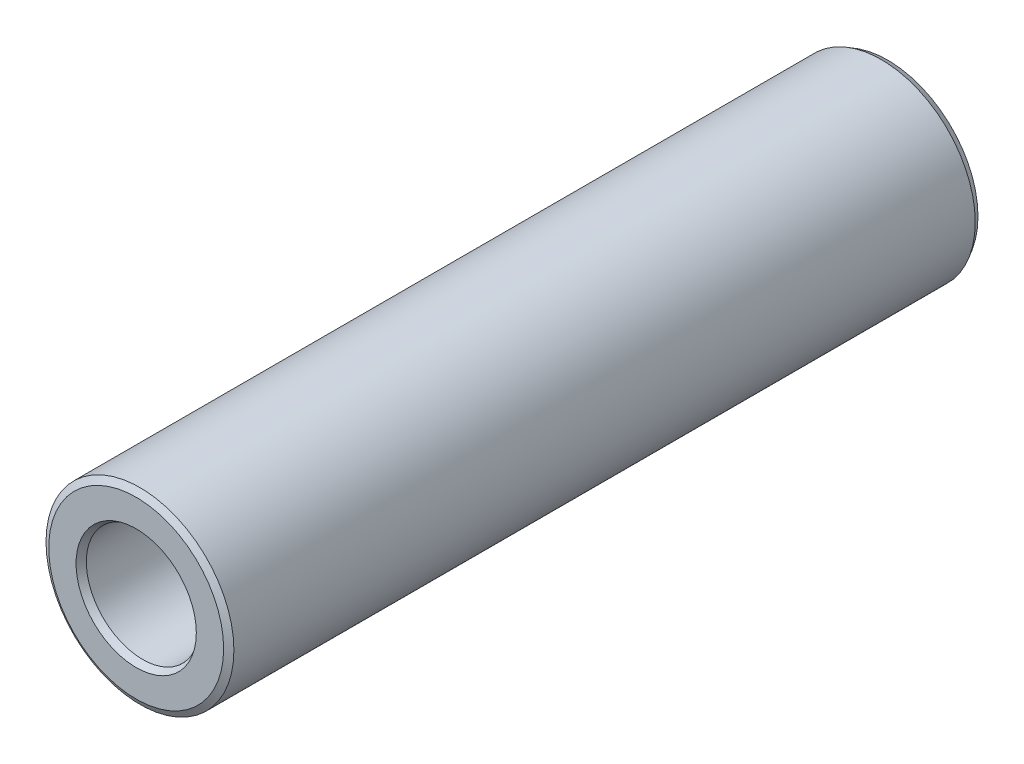
ISO-10303-21;
HEADER;
FILE_DESCRIPTION(('STEP AP214'),'2;1');
FILE_NAME('part.step','',(''),(''),'','','');
FILE_SCHEMA(('AUTOMOTIVE_DESIGN { 1 0 10303 214 1 1 1 1 }'));
ENDSEC;
DATA;
#1=APPLICATION_CONTEXT('core data for automotive mechanical design processes');
#2=APPLICATION_PROTOCOL_DEFINITION('international standard','automotive_design',2000,#1);
#3=PRODUCT_CONTEXT('',#1,'mechanical');
#4=PRODUCT('Part','Part','',(#3));
#5=PRODUCT_RELATED_PRODUCT_CATEGORY('part','',(#4));
#6=PRODUCT_DEFINITION_FORMATION('','',#4);
#7=PRODUCT_DEFINITION_CONTEXT('part definition',#1,'design');
#8=PRODUCT_DEFINITION('design','',#6,#7);
#9=PRODUCT_DEFINITION_SHAPE('','',#8);
#10=(LENGTH_UNIT() NAMED_UNIT(*) SI_UNIT(.MILLI.,.METRE.));
#11=(NAMED_UNIT(*) PLANE_ANGLE_UNIT() SI_UNIT($,.RADIAN.));
#12=(NAMED_UNIT(*) SI_UNIT($,.STERADIAN.) SOLID_ANGLE_UNIT());
#13=UNCERTAINTY_MEASURE_WITH_UNIT(LENGTH_MEASURE(1.E-05),#10,'distance_accuracy_value','');
#14=(GEOMETRIC_REPRESENTATION_CONTEXT(3) GLOBAL_UNCERTAINTY_ASSIGNED_CONTEXT((#13)) GLOBAL_UNIT_ASSIGNED_CONTEXT((#10,
#11,#12)) REPRESENTATION_CONTEXT('',''));
#15=CARTESIAN_POINT('',(0.,0.,0.));
#16=DIRECTION('',(0.,0.,1.));
#17=DIRECTION('',(1.,0.,0.));
#18=AXIS2_PLACEMENT_3D('',#15,#16,#17);
#19=CARTESIAN_POINT('',(0.,0.,10.));
#20=DIRECTION('',(0.,0.,1.));
#21=DIRECTION('',(1.,0.,0.));
#22=AXIS2_PLACEMENT_3D('',#19,#20,#21);
#23=PLANE('',#22);
#24=CARTESIAN_POINT('',(0.,0.,10.));
#25=DIRECTION('',(0.,0.,1.));
#26=DIRECTION('',(1.,0.,0.));
#27=AXIS2_PLACEMENT_3D('',#24,#25,#26);
#28=CIRCLE('',#27,1.6);
#29=CARTESIAN_POINT('',(1.6,0.,10.));
#30=VERTEX_POINT('',#29);
#31=EDGE_CURVE('E10',#30,#30,#28,.F.);
#32=ORIENTED_EDGE('',*,*,#31,.T.);
#33=EDGE_LOOP('',(#32));
#34=FACE_BOUND('',#33,.T.);
#35=CARTESIAN_POINT('',(0.,0.,10.));
#36=DIRECTION('',(0.,0.,1.));
#37=DIRECTION('',(1.,0.,0.));
#38=AXIS2_PLACEMENT_3D('',#35,#36,#37);
#39=CIRCLE('',#38,2.32679491924311);
#40=CARTESIAN_POINT('',(2.32679491924311,0.,10.));
#41=VERTEX_POINT('',#40);
#42=EDGE_CURVE('E51',#41,#41,#39,.T.);
#43=ORIENTED_EDGE('',*,*,#42,.T.);
#44=EDGE_LOOP('',(#43));
#45=FACE_BOUND('',#44,.T.);
#46=ADVANCED_FACE('F43',(#34,#45),#23,.T.);
#47=CARTESIAN_POINT('',(0.,0.,-10.));
#48=DIRECTION('',(0.,0.,1.));
#49=DIRECTION('',(1.,0.,0.));
#50=AXIS2_PLACEMENT_3D('',#47,#48,#49);
#51=PLANE('',#50);
#52=CARTESIAN_POINT('',(0.,0.,-10.));
#53=DIRECTION('',(0.,0.,1.));
#54=DIRECTION('',(1.,0.,0.));
#55=AXIS2_PLACEMENT_3D('',#52,#53,#54);
#56=CIRCLE('',#55,1.67320508075689);
#57=CARTESIAN_POINT('',(1.67320508075689,0.,-10.));
#58=VERTEX_POINT('',#57);
#59=EDGE_CURVE('E68',#58,#58,#56,.T.);
#60=ORIENTED_EDGE('',*,*,#59,.T.);
#61=EDGE_LOOP('',(#60));
#62=FACE_BOUND('',#61,.T.);
#63=CARTESIAN_POINT('',(0.,0.,-10.));
#64=DIRECTION('',(0.,0.,1.));
#65=DIRECTION('',(1.,0.,0.));
#66=AXIS2_PLACEMENT_3D('',#63,#64,#65);
#67=CIRCLE('',#66,2.39999999999999);
#68=CARTESIAN_POINT('',(2.39999999999999,0.,-10.));
#69=VERTEX_POINT('',#68);
#70=EDGE_CURVE('E71',#69,#69,#67,.F.);
#71=ORIENTED_EDGE('',*,*,#70,.T.);
#72=EDGE_LOOP('',(#71));
#73=FACE_BOUND('',#72,.T.);
#74=ADVANCED_FACE('F80',(#62,#73),#51,.F.);
#75=CARTESIAN_POINT('',(0.,0.,10.));
#76=DIRECTION('',(0.,0.,-1.));
#77=DIRECTION('',(-1.,0.,0.));
#78=AXIS2_PLACEMENT_3D('',#75,#76,#77);
#79=CYLINDRICAL_SURFACE('',#78,2.5);
#80=CARTESIAN_POINT('',(0.,0.,-9.82679491924309));
#81=DIRECTION('',(0.,0.,1.));
#82=DIRECTION('',(1.,0.,0.));
#83=AXIS2_PLACEMENT_3D('',#80,#81,#82);
#84=CIRCLE('',#83,2.5);
#85=CARTESIAN_POINT('',(2.5,0.,-9.82679491924309));
#86=VERTEX_POINT('',#85);
#87=EDGE_CURVE('E54',#86,#86,#84,.T.);
#88=ORIENTED_EDGE('',*,*,#87,.T.);
#89=EDGE_LOOP('',(#88));
#90=FACE_BOUND('',#89,.T.);
#91=CARTESIAN_POINT('',(0.,0.,9.9));
#92=DIRECTION('',(0.,0.,1.));
#93=DIRECTION('',(1.,0.,0.));
#94=AXIS2_PLACEMENT_3D('',#91,#92,#93);
#95=CIRCLE('',#94,2.5);
#96=CARTESIAN_POINT('',(2.5,0.,9.9));
#97=VERTEX_POINT('',#96);
#98=EDGE_CURVE('E56',#97,#97,#95,.F.);
#99=ORIENTED_EDGE('',*,*,#98,.T.);
#100=EDGE_LOOP('',(#99));
#101=FACE_BOUND('',#100,.T.);
#102=ADVANCED_FACE('F87',(#90,#101),#79,.T.);
#103=CARTESIAN_POINT('',(0.,0.,10.));
#104=DIRECTION('',(0.,0.,-1.));
#105=DIRECTION('',(-1.,0.,0.));
#106=AXIS2_PLACEMENT_3D('',#103,#104,#105);
#107=CYLINDRICAL_SURFACE('',#106,1.5);
#108=CARTESIAN_POINT('',(0.,0.,-9.9));
#109=DIRECTION('',(0.,0.,1.));
#110=DIRECTION('',(1.,0.,0.));
#111=AXIS2_PLACEMENT_3D('',#108,#109,#110);
#112=CIRCLE('',#111,1.5);
#113=CARTESIAN_POINT('',(1.5,0.,-9.9));
#114=VERTEX_POINT('',#113);
#115=EDGE_CURVE('E61',#114,#114,#112,.F.);
#116=ORIENTED_EDGE('',*,*,#115,.T.);
#117=EDGE_LOOP('',(#116));
#118=FACE_BOUND('',#117,.T.);
#119=CARTESIAN_POINT('',(0.,0.,9.82679491924311));
#120=DIRECTION('',(0.,0.,1.));
#121=DIRECTION('',(1.,0.,0.));
#122=AXIS2_PLACEMENT_3D('',#119,#120,#121);
#123=CIRCLE('',#122,1.5);
#124=CARTESIAN_POINT('',(1.5,0.,9.82679491924311));
#125=VERTEX_POINT('',#124);
#126=EDGE_CURVE('E70',#125,#125,#123,.T.);
#127=ORIENTED_EDGE('',*,*,#126,.T.);
#128=EDGE_LOOP('',(#127));
#129=FACE_BOUND('',#128,.T.);
#130=ADVANCED_FACE('F89',(#118,#129),#107,.F.);
#131=CARTESIAN_POINT('',(0.,0.,-10.));
#132=DIRECTION('',(0.,0.,-1.));
#133=DIRECTION('',(-1.,0.,0.));
#134=AXIS2_PLACEMENT_3D('',#131,#132,#133);
#135=CONICAL_SURFACE('',#134,1.67320508075689,1.0471975511966);
#136=ORIENTED_EDGE('',*,*,#115,.F.);
#137=EDGE_LOOP('',(#136));
#138=FACE_BOUND('',#137,.T.);
#139=ORIENTED_EDGE('',*,*,#59,.F.);
#140=EDGE_LOOP('',(#139));
#141=FACE_BOUND('',#140,.T.);
#142=ADVANCED_FACE('F84',(#138,#141),#135,.F.);
#143=CARTESIAN_POINT('',(0.,0.,-9.82679491924309));
#144=DIRECTION('',(0.,0.,1.));
#145=DIRECTION('',(1.,0.,0.));
#146=AXIS2_PLACEMENT_3D('',#143,#144,#145);
#147=CONICAL_SURFACE('',#146,2.5,0.523598775598298);
#148=ORIENTED_EDGE('',*,*,#70,.F.);
#149=EDGE_LOOP('',(#148));
#150=FACE_BOUND('',#149,.T.);
#151=ORIENTED_EDGE('',*,*,#87,.F.);
#152=EDGE_LOOP('',(#151));
#153=FACE_BOUND('',#152,.T.);
#154=ADVANCED_FACE('F76',(#150,#153),#147,.T.);
#155=CARTESIAN_POINT('',(0.,0.,9.82679491924311));
#156=DIRECTION('',(0.,0.,1.));
#157=DIRECTION('',(1.,0.,0.));
#158=AXIS2_PLACEMENT_3D('',#155,#156,#157);
#159=CONICAL_SURFACE('',#158,1.5,0.5235987755983);
#160=ORIENTED_EDGE('',*,*,#31,.F.);
#161=EDGE_LOOP('',(#160));
#162=FACE_BOUND('',#161,.T.);
#163=ORIENTED_EDGE('',*,*,#126,.F.);
#164=EDGE_LOOP('',(#163));
#165=FACE_BOUND('',#164,.T.);
#166=ADVANCED_FACE('F85',(#162,#165),#159,.F.);
#167=CARTESIAN_POINT('',(0.,0.,10.));
#168=DIRECTION('',(0.,0.,-1.));
#169=DIRECTION('',(-1.,0.,0.));
#170=AXIS2_PLACEMENT_3D('',#167,#168,#169);
#171=CONICAL_SURFACE('',#170,2.32679491924311,1.0471975511966);
#172=ORIENTED_EDGE('',*,*,#98,.F.);
#173=EDGE_LOOP('',(#172));
#174=FACE_BOUND('',#173,.T.);
#175=ORIENTED_EDGE('',*,*,#42,.F.);
#176=EDGE_LOOP('',(#175));
#177=FACE_BOUND('',#176,.T.);
#178=ADVANCED_FACE('F46',(#174,#177),#171,.T.);
#179=CLOSED_SHELL('',(#46,#74,#102,#130,#142,#154,#166,#178));
#180=MANIFOLD_SOLID_BREP('B2',#179);
#181=ADVANCED_BREP_SHAPE_REPRESENTATION('',(#18,#180),#14);
#182=SHAPE_DEFINITION_REPRESENTATION(#9,#181);
ENDSEC;
END-ISO-10303-21;
